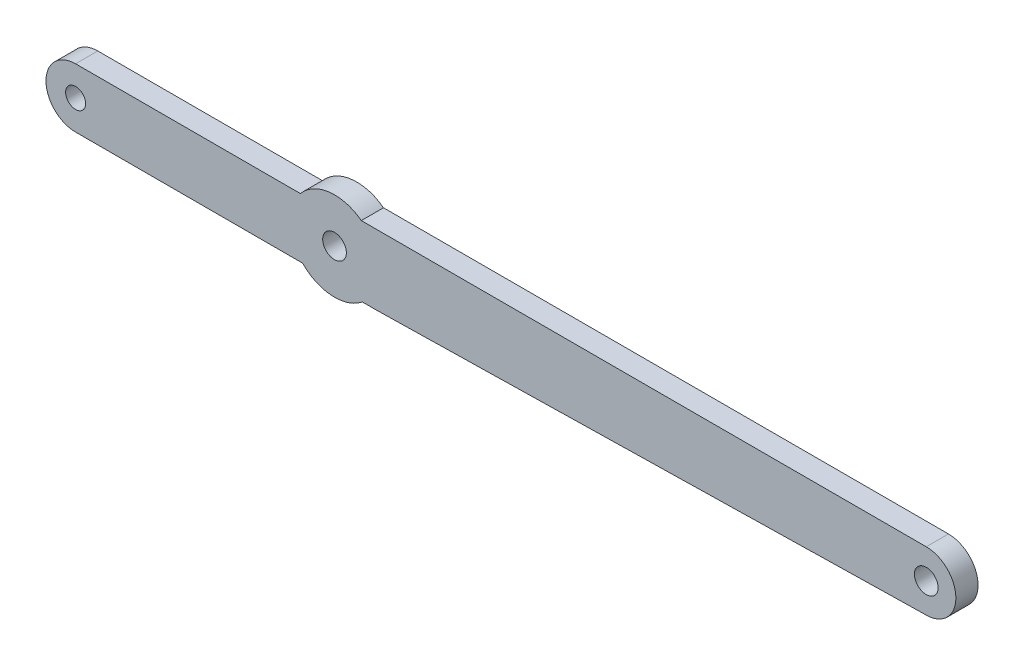
ISO-10303-21;
HEADER;
FILE_DESCRIPTION(('STEP AP214'),'2;1');
FILE_NAME('part.step','',(''),(''),'','','');
FILE_SCHEMA(('AUTOMOTIVE_DESIGN { 1 0 10303 214 1 1 1 1 }'));
ENDSEC;
DATA;
#1=APPLICATION_CONTEXT('core data for automotive mechanical design processes');
#2=APPLICATION_PROTOCOL_DEFINITION('international standard','automotive_design',2000,#1);
#3=PRODUCT_CONTEXT('',#1,'mechanical');
#4=PRODUCT('Part','Part','',(#3));
#5=PRODUCT_RELATED_PRODUCT_CATEGORY('part','',(#4));
#6=PRODUCT_DEFINITION_FORMATION('','',#4);
#7=PRODUCT_DEFINITION_CONTEXT('part definition',#1,'design');
#8=PRODUCT_DEFINITION('design','',#6,#7);
#9=PRODUCT_DEFINITION_SHAPE('','',#8);
#10=(LENGTH_UNIT() NAMED_UNIT(*) SI_UNIT(.MILLI.,.METRE.));
#11=(NAMED_UNIT(*) PLANE_ANGLE_UNIT() SI_UNIT($,.RADIAN.));
#12=(NAMED_UNIT(*) SI_UNIT($,.STERADIAN.) SOLID_ANGLE_UNIT());
#13=UNCERTAINTY_MEASURE_WITH_UNIT(LENGTH_MEASURE(1.E-05),#10,'distance_accuracy_value','');
#14=(GEOMETRIC_REPRESENTATION_CONTEXT(3) GLOBAL_UNCERTAINTY_ASSIGNED_CONTEXT((#13)) GLOBAL_UNIT_ASSIGNED_CONTEXT((#10,
#11,#12)) REPRESENTATION_CONTEXT('',''));
#15=CARTESIAN_POINT('',(0.,0.,0.));
#16=DIRECTION('',(0.,0.,1.));
#17=DIRECTION('',(1.,0.,0.));
#18=AXIS2_PLACEMENT_3D('',#15,#16,#17);
#19=CARTESIAN_POINT('',(-56.215610459493,3.68212259985008,-1.40729441988618E-11));
#20=DIRECTION('',(0.,0.,1.));
#21=DIRECTION('',(1.,0.,0.));
#22=AXIS2_PLACEMENT_3D('',#19,#20,#21);
#23=PLANE('',#22);
#24=CARTESIAN_POINT('',(-56.215610459493,3.68212259985008,0.));
#25=DIRECTION('',(0.,0.,-1.));
#26=DIRECTION('',(-1.,0.,0.));
#27=AXIS2_PLACEMENT_3D('',#24,#25,#26);
#28=CIRCLE('',#27,1.6);
#29=CARTESIAN_POINT('',(-57.815610459493,3.68212259985008,0.));
#30=VERTEX_POINT('',#29);
#31=EDGE_CURVE('E239',#30,#30,#28,.T.);
#32=ORIENTED_EDGE('',*,*,#31,.F.);
#33=EDGE_LOOP('',(#32));
#34=FACE_BOUND('',#33,.T.);
#35=CARTESIAN_POINT('',(-91.2186643045453,3.51409417940278,0.));
#36=DIRECTION('',(0.,0.,-1.));
#37=DIRECTION('',(-1.,0.,0.));
#38=AXIS2_PLACEMENT_3D('',#35,#36,#37);
#39=CIRCLE('',#38,1.35000000000001);
#40=CARTESIAN_POINT('',(-92.5686643045453,3.51409417940278,0.));
#41=VERTEX_POINT('',#40);
#42=EDGE_CURVE('E251',#41,#41,#39,.T.);
#43=ORIENTED_EDGE('',*,*,#42,.F.);
#44=EDGE_LOOP('',(#43));
#45=FACE_BOUND('',#44,.T.);
#46=CARTESIAN_POINT('',(-56.215610459493,3.68212259985008,-1.40729441988618E-11));
#47=DIRECTION('',(0.,0.,1.));
#48=DIRECTION('',(1.,0.,0.));
#49=AXIS2_PLACEMENT_3D('',#46,#47,#48);
#50=CIRCLE('',#49,6.);
#51=CARTESIAN_POINT('',(-52.5963583188452,8.46762298564217,-1.40729441988618E-11));
#52=VERTEX_POINT('',#51);
#53=CARTESIAN_POINT('',(-60.8325351733583,7.51409417940278,-1.40729441988618E-11));
#54=VERTEX_POINT('',#53);
#55=EDGE_CURVE('E179',#52,#54,#50,.T.);
#56=ORIENTED_EDGE('',*,*,#55,.F.);
#57=DIRECTION('',(-1.,0.,0.));
#58=VECTOR('',#57,1.);
#59=CARTESIAN_POINT('',(23.778016459137,8.46762298564218,-1.40729441988618E-11));
#60=LINE('',#59,#58);
#61=CARTESIAN_POINT('',(23.778016459137,8.46762298564218,-1.40729441988618E-11));
#62=VERTEX_POINT('',#61);
#63=EDGE_CURVE('E139',#62,#52,#60,.T.);
#64=ORIENTED_EDGE('',*,*,#63,.F.);
#65=CARTESIAN_POINT('',(23.7780164591309,4.46772306187524,-1.40729441988618E-11));
#66=DIRECTION('',(0.,0.,1.));
#67=DIRECTION('',(1.,0.,0.));
#68=AXIS2_PLACEMENT_3D('',#65,#66,#67);
#69=CIRCLE('',#68,3.99989992376694);
#70=CARTESIAN_POINT('',(23.8565679815805,0.468594524497169,-1.40729441988618E-11));
#71=VERTEX_POINT('',#70);
#72=EDGE_CURVE('E129',#71,#62,#69,.T.);
#73=ORIENTED_EDGE('',*,*,#72,.F.);
#74=DIRECTION('',(0.99980714857782,0.0196383719459742,0.));
#75=VECTOR('',#74,1.);
#76=CARTESIAN_POINT('',(-50.4209825448811,-0.990377004711705,-1.40729441988618E-11));
#77=LINE('',#76,#75);
#78=CARTESIAN_POINT('',(-50.4209825448811,-0.990377004711705,-1.40729441988618E-11));
#79=VERTEX_POINT('',#78);
#80=EDGE_CURVE('E118',#79,#71,#77,.T.);
#81=ORIENTED_EDGE('',*,*,#80,.F.);
#82=DIRECTION('',(1.,0.,0.));
#83=VECTOR('',#82,1.);
#84=CARTESIAN_POINT('',(-52.4516036256297,-0.990377004711713,-1.40729441988618E-11));
#85=LINE('',#84,#83);
#86=CARTESIAN_POINT('',(-52.4516036256297,-0.990377004711713,-1.40729441988618E-11));
#87=VERTEX_POINT('',#86);
#88=EDGE_CURVE('E130',#87,#79,#85,.T.);
#89=ORIENTED_EDGE('',*,*,#88,.F.);
#90=CARTESIAN_POINT('',(-56.215610459493,3.68212259985008,-1.40729441988618E-11));
#91=DIRECTION('',(0.,0.,1.));
#92=DIRECTION('',(1.,0.,0.));
#93=AXIS2_PLACEMENT_3D('',#90,#91,#92);
#94=CIRCLE('',#93,6.);
#95=CARTESIAN_POINT('',(-60.5315737455212,-0.485905820597219,-1.40729441988618E-11));
#96=VERTEX_POINT('',#95);
#97=EDGE_CURVE('E272',#96,#87,#94,.T.);
#98=ORIENTED_EDGE('',*,*,#97,.F.);
#99=DIRECTION('',(1.,0.,0.));
#100=VECTOR('',#99,1.);
#101=CARTESIAN_POINT('',(-91.2186643045453,-0.485905820597216,-1.40729441988618E-11));
#102=LINE('',#101,#100);
#103=CARTESIAN_POINT('',(-91.2186643045453,-0.485905820597216,-1.40729441988618E-11));
#104=VERTEX_POINT('',#103);
#105=EDGE_CURVE('E268',#104,#96,#102,.T.);
#106=ORIENTED_EDGE('',*,*,#105,.F.);
#107=CARTESIAN_POINT('',(-91.2186643045453,3.51409417940278,-1.40729441988618E-11));
#108=DIRECTION('',(0.,0.,1.));
#109=DIRECTION('',(1.,0.,0.));
#110=AXIS2_PLACEMENT_3D('',#107,#108,#109);
#111=CIRCLE('',#110,4.);
#112=CARTESIAN_POINT('',(-91.2186643045453,7.51409417940278,-1.40729441988618E-11));
#113=VERTEX_POINT('',#112);
#114=EDGE_CURVE('E264',#113,#104,#111,.T.);
#115=ORIENTED_EDGE('',*,*,#114,.F.);
#116=DIRECTION('',(-1.,0.,0.));
#117=VECTOR('',#116,1.);
#118=CARTESIAN_POINT('',(-60.8325351733583,7.51409417940278,-1.40729441988618E-11));
#119=LINE('',#118,#117);
#120=EDGE_CURVE('E261',#54,#113,#119,.T.);
#121=ORIENTED_EDGE('',*,*,#120,.F.);
#122=EDGE_LOOP('',(#56,#64,#73,#81,#89,#98,#106,#115,#121));
#123=FACE_BOUND('',#122,.T.);
#124=CARTESIAN_POINT('',(23.7780174551179,4.4678231769752,0.));
#125=DIRECTION('',(0.,0.,1.));
#126=DIRECTION('',(1.,0.,0.));
#127=AXIS2_PLACEMENT_3D('',#124,#125,#126);
#128=CIRCLE('',#127,1.6);
#129=CARTESIAN_POINT('',(25.3780174551179,4.4678231769752,0.));
#130=VERTEX_POINT('',#129);
#131=EDGE_CURVE('E237',#130,#130,#128,.T.);
#132=ORIENTED_EDGE('',*,*,#131,.T.);
#133=EDGE_LOOP('',(#132));
#134=FACE_BOUND('',#133,.T.);
#135=ADVANCED_FACE('F39',(#34,#45,#123,#134),#23,.F.);
#136=CARTESIAN_POINT('',(-56.215610459493,3.68212259985008,3.));
#137=DIRECTION('',(0.,0.,1.));
#138=DIRECTION('',(1.,0.,0.));
#139=AXIS2_PLACEMENT_3D('',#136,#137,#138);
#140=PLANE('',#139);
#141=CARTESIAN_POINT('',(-56.215610459493,3.68212259985008,3.));
#142=DIRECTION('',(0.,0.,1.));
#143=DIRECTION('',(1.,0.,0.));
#144=AXIS2_PLACEMENT_3D('',#141,#142,#143);
#145=CIRCLE('',#144,6.);
#146=CARTESIAN_POINT('',(-52.5963583188452,8.46762298564217,3.));
#147=VERTEX_POINT('',#146);
#148=CARTESIAN_POINT('',(-60.8325351733583,7.51409417940278,3.));
#149=VERTEX_POINT('',#148);
#150=EDGE_CURVE('E146',#147,#149,#145,.T.);
#151=ORIENTED_EDGE('',*,*,#150,.T.);
#152=DIRECTION('',(-1.,0.,0.));
#153=VECTOR('',#152,1.);
#154=CARTESIAN_POINT('',(-60.8325351733583,7.51409417940278,3.));
#155=LINE('',#154,#153);
#156=CARTESIAN_POINT('',(-91.2186643045453,7.51409417940278,3.));
#157=VERTEX_POINT('',#156);
#158=EDGE_CURVE('E150',#149,#157,#155,.T.);
#159=ORIENTED_EDGE('',*,*,#158,.T.);
#160=CARTESIAN_POINT('',(-91.2186643045453,3.51409417940278,3.));
#161=DIRECTION('',(0.,0.,1.));
#162=DIRECTION('',(1.,0.,0.));
#163=AXIS2_PLACEMENT_3D('',#160,#161,#162);
#164=CIRCLE('',#163,4.);
#165=CARTESIAN_POINT('',(-91.2186643045453,-0.485905820597216,3.));
#166=VERTEX_POINT('',#165);
#167=EDGE_CURVE('E155',#157,#166,#164,.T.);
#168=ORIENTED_EDGE('',*,*,#167,.T.);
#169=DIRECTION('',(1.,0.,0.));
#170=VECTOR('',#169,1.);
#171=CARTESIAN_POINT('',(-91.2186643045453,-0.485905820597216,3.));
#172=LINE('',#171,#170);
#173=CARTESIAN_POINT('',(-60.5315737455212,-0.485905820597219,3.));
#174=VERTEX_POINT('',#173);
#175=EDGE_CURVE('E159',#166,#174,#172,.T.);
#176=ORIENTED_EDGE('',*,*,#175,.T.);
#177=CARTESIAN_POINT('',(-56.215610459493,3.68212259985008,3.));
#178=DIRECTION('',(0.,0.,1.));
#179=DIRECTION('',(1.,0.,0.));
#180=AXIS2_PLACEMENT_3D('',#177,#178,#179);
#181=CIRCLE('',#180,6.);
#182=CARTESIAN_POINT('',(-52.4516036256297,-0.990377004711713,3.));
#183=VERTEX_POINT('',#182);
#184=EDGE_CURVE('E163',#174,#183,#181,.T.);
#185=ORIENTED_EDGE('',*,*,#184,.T.);
#186=DIRECTION('',(1.,0.,0.));
#187=VECTOR('',#186,1.);
#188=CARTESIAN_POINT('',(-52.4516036256297,-0.990377004711713,3.));
#189=LINE('',#188,#187);
#190=CARTESIAN_POINT('',(-50.4209825448811,-0.990377004711705,3.));
#191=VERTEX_POINT('',#190);
#192=EDGE_CURVE('E167',#183,#191,#189,.T.);
#193=ORIENTED_EDGE('',*,*,#192,.T.);
#194=DIRECTION('',(0.999807148577821,0.0196383719459381,0.));
#195=VECTOR('',#194,1.);
#196=CARTESIAN_POINT('',(23.8165609183604,0.467808699361691,3.));
#197=LINE('',#196,#195);
#198=CARTESIAN_POINT('',(23.8565679815805,0.468594524497169,3.));
#199=VERTEX_POINT('',#198);
#200=EDGE_CURVE('E171',#191,#199,#197,.T.);
#201=ORIENTED_EDGE('',*,*,#200,.T.);
#202=CARTESIAN_POINT('',(23.7780164591309,4.46772306187524,3.));
#203=DIRECTION('',(0.,0.,1.));
#204=DIRECTION('',(1.,0.,0.));
#205=AXIS2_PLACEMENT_3D('',#202,#203,#204);
#206=CIRCLE('',#205,3.99989992376694);
#207=CARTESIAN_POINT('',(23.778016459137,8.46762298564218,3.));
#208=VERTEX_POINT('',#207);
#209=EDGE_CURVE('E134',#199,#208,#206,.T.);
#210=ORIENTED_EDGE('',*,*,#209,.T.);
#211=DIRECTION('',(-1.,0.,0.));
#212=VECTOR('',#211,1.);
#213=CARTESIAN_POINT('',(23.778016459137,8.46762298564218,3.));
#214=LINE('',#213,#212);
#215=EDGE_CURVE('E176',#208,#147,#214,.T.);
#216=ORIENTED_EDGE('',*,*,#215,.T.);
#217=EDGE_LOOP('',(#151,#159,#168,#176,#185,#193,#201,#210,#216));
#218=FACE_BOUND('',#217,.T.);
#219=CARTESIAN_POINT('',(-91.2186643045453,3.51409417940278,3.));
#220=DIRECTION('',(0.,0.,-1.));
#221=DIRECTION('',(-1.,0.,0.));
#222=AXIS2_PLACEMENT_3D('',#219,#220,#221);
#223=CIRCLE('',#222,1.35000000000001);
#224=CARTESIAN_POINT('',(-92.5686643045453,3.51409417940278,3.));
#225=VERTEX_POINT('',#224);
#226=EDGE_CURVE('E255',#225,#225,#223,.T.);
#227=ORIENTED_EDGE('',*,*,#226,.T.);
#228=EDGE_LOOP('',(#227));
#229=FACE_BOUND('',#228,.T.);
#230=CARTESIAN_POINT('',(-56.215610459493,3.68212259985008,3.));
#231=DIRECTION('',(0.,0.,-1.));
#232=DIRECTION('',(-1.,0.,0.));
#233=AXIS2_PLACEMENT_3D('',#230,#231,#232);
#234=CIRCLE('',#233,1.6);
#235=CARTESIAN_POINT('',(-57.815610459493,3.68212259985008,3.));
#236=VERTEX_POINT('',#235);
#237=EDGE_CURVE('E245',#236,#236,#234,.T.);
#238=ORIENTED_EDGE('',*,*,#237,.T.);
#239=EDGE_LOOP('',(#238));
#240=FACE_BOUND('',#239,.T.);
#241=CARTESIAN_POINT('',(23.7780174551179,4.4678231769752,3.));
#242=DIRECTION('',(0.,0.,1.));
#243=DIRECTION('',(1.,0.,0.));
#244=AXIS2_PLACEMENT_3D('',#241,#242,#243);
#245=CIRCLE('',#244,1.6);
#246=CARTESIAN_POINT('',(25.3780174551179,4.4678231769752,3.));
#247=VERTEX_POINT('',#246);
#248=EDGE_CURVE('E151',#247,#247,#245,.T.);
#249=ORIENTED_EDGE('',*,*,#248,.F.);
#250=EDGE_LOOP('',(#249));
#251=FACE_BOUND('',#250,.T.);
#252=ADVANCED_FACE('F199',(#218,#229,#240,#251),#140,.T.);
#253=CARTESIAN_POINT('',(-56.215610459493,3.68212259985008,-1.40729441988618E-11));
#254=DIRECTION('',(0.,0.,1.));
#255=DIRECTION('',(1.,0.,0.));
#256=AXIS2_PLACEMENT_3D('',#253,#254,#255);
#257=CYLINDRICAL_SURFACE('',#256,6.);
#258=ORIENTED_EDGE('',*,*,#150,.F.);
#259=DIRECTION('',(0.,0.,1.));
#260=VECTOR('',#259,1.);
#261=CARTESIAN_POINT('',(-52.5963583188452,8.46762298564217,-1.40729441988618E-11));
#262=LINE('',#261,#260);
#263=EDGE_CURVE('E11',#52,#147,#262,.T.);
#264=ORIENTED_EDGE('',*,*,#263,.F.);
#265=ORIENTED_EDGE('',*,*,#55,.T.);
#266=DIRECTION('',(0.,0.,1.));
#267=VECTOR('',#266,1.);
#268=CARTESIAN_POINT('',(-60.8325351733583,7.51409417940278,-1.40729441988618E-11));
#269=LINE('',#268,#267);
#270=EDGE_CURVE('E43',#54,#149,#269,.T.);
#271=ORIENTED_EDGE('',*,*,#270,.T.);
#272=EDGE_LOOP('',(#258,#264,#265,#271));
#273=FACE_BOUND('',#272,.T.);
#274=ADVANCED_FACE('F41',(#273),#257,.T.);
#275=CARTESIAN_POINT('',(23.778016459137,8.46762298564218,-1.40729441988618E-11));
#276=DIRECTION('',(0.,1.,0.));
#277=DIRECTION('',(-1.,0.,0.));
#278=AXIS2_PLACEMENT_3D('',#275,#276,#277);
#279=PLANE('',#278);
#280=ORIENTED_EDGE('',*,*,#215,.F.);
#281=DIRECTION('',(0.,0.,1.));
#282=VECTOR('',#281,1.);
#283=CARTESIAN_POINT('',(23.778016459137,8.46762298564218,-1.40729441988618E-11));
#284=LINE('',#283,#282);
#285=EDGE_CURVE('E50',#62,#208,#284,.T.);
#286=ORIENTED_EDGE('',*,*,#285,.F.);
#287=ORIENTED_EDGE('',*,*,#63,.T.);
#288=ORIENTED_EDGE('',*,*,#263,.T.);
#289=EDGE_LOOP('',(#280,#286,#287,#288));
#290=FACE_BOUND('',#289,.T.);
#291=ADVANCED_FACE('F201',(#290),#279,.T.);
#292=CARTESIAN_POINT('',(23.7780164591309,4.46772306187524,-1.40729441988618E-11));
#293=DIRECTION('',(0.,0.,1.));
#294=DIRECTION('',(1.,0.,0.));
#295=AXIS2_PLACEMENT_3D('',#292,#293,#294);
#296=CYLINDRICAL_SURFACE('',#295,3.99989992376694);
#297=ORIENTED_EDGE('',*,*,#209,.F.);
#298=DIRECTION('',(0.,0.,1.));
#299=VECTOR('',#298,1.);
#300=CARTESIAN_POINT('',(23.8565679815805,0.468594524497169,-1.40729441988618E-11));
#301=LINE('',#300,#299);
#302=EDGE_CURVE('E121',#71,#199,#301,.T.);
#303=ORIENTED_EDGE('',*,*,#302,.F.);
#304=ORIENTED_EDGE('',*,*,#72,.T.);
#305=ORIENTED_EDGE('',*,*,#285,.T.);
#306=EDGE_LOOP('',(#297,#303,#304,#305));
#307=FACE_BOUND('',#306,.T.);
#308=ADVANCED_FACE('F132',(#307),#296,.T.);
#309=CARTESIAN_POINT('',(23.8165609183604,0.467808699361691,-1.40729441988618E-11));
#310=DIRECTION('',(0.0196383719459381,-0.999807148577821,0.));
#311=DIRECTION('',(0.999807148577821,0.0196383719459381,0.));
#312=AXIS2_PLACEMENT_3D('',#309,#310,#311);
#313=PLANE('',#312);
#314=ORIENTED_EDGE('',*,*,#200,.F.);
#315=DIRECTION('',(0.,0.,1.));
#316=VECTOR('',#315,1.);
#317=CARTESIAN_POINT('',(-50.4209825448811,-0.990377004711705,-1.40729441988618E-11));
#318=LINE('',#317,#316);
#319=EDGE_CURVE('E123',#79,#191,#318,.T.);
#320=ORIENTED_EDGE('',*,*,#319,.F.);
#321=ORIENTED_EDGE('',*,*,#80,.T.);
#322=ORIENTED_EDGE('',*,*,#302,.T.);
#323=EDGE_LOOP('',(#314,#320,#321,#322));
#324=FACE_BOUND('',#323,.T.);
#325=ADVANCED_FACE('F120',(#324),#313,.T.);
#326=CARTESIAN_POINT('',(-52.4516036256297,-0.990377004711713,-1.40729441988618E-11));
#327=DIRECTION('',(0.,-1.,0.));
#328=DIRECTION('',(1.,0.,0.));
#329=AXIS2_PLACEMENT_3D('',#326,#327,#328);
#330=PLANE('',#329);
#331=ORIENTED_EDGE('',*,*,#192,.F.);
#332=DIRECTION('',(0.,0.,1.));
#333=VECTOR('',#332,1.);
#334=CARTESIAN_POINT('',(-52.4516036256297,-0.990377004711713,-1.40729441988618E-11));
#335=LINE('',#334,#333);
#336=EDGE_CURVE('E185',#87,#183,#335,.T.);
#337=ORIENTED_EDGE('',*,*,#336,.F.);
#338=ORIENTED_EDGE('',*,*,#88,.T.);
#339=ORIENTED_EDGE('',*,*,#319,.T.);
#340=EDGE_LOOP('',(#331,#337,#338,#339));
#341=FACE_BOUND('',#340,.T.);
#342=ADVANCED_FACE('F278',(#341),#330,.T.);
#343=CARTESIAN_POINT('',(-56.215610459493,3.68212259985008,-1.40729441988618E-11));
#344=DIRECTION('',(0.,0.,1.));
#345=DIRECTION('',(1.,0.,0.));
#346=AXIS2_PLACEMENT_3D('',#343,#344,#345);
#347=CYLINDRICAL_SURFACE('',#346,6.);
#348=ORIENTED_EDGE('',*,*,#184,.F.);
#349=DIRECTION('',(0.,0.,1.));
#350=VECTOR('',#349,1.);
#351=CARTESIAN_POINT('',(-60.5315737455212,-0.485905820597219,-1.40729441988618E-11));
#352=LINE('',#351,#350);
#353=EDGE_CURVE('E188',#96,#174,#352,.T.);
#354=ORIENTED_EDGE('',*,*,#353,.F.);
#355=ORIENTED_EDGE('',*,*,#97,.T.);
#356=ORIENTED_EDGE('',*,*,#336,.T.);
#357=EDGE_LOOP('',(#348,#354,#355,#356));
#358=FACE_BOUND('',#357,.T.);
#359=ADVANCED_FACE('F283',(#358),#347,.T.);
#360=CARTESIAN_POINT('',(-91.2186643045453,-0.485905820597216,-1.40729441988618E-11));
#361=DIRECTION('',(0.,-1.,0.));
#362=DIRECTION('',(1.,0.,0.));
#363=AXIS2_PLACEMENT_3D('',#360,#361,#362);
#364=PLANE('',#363);
#365=ORIENTED_EDGE('',*,*,#175,.F.);
#366=DIRECTION('',(0.,0.,1.));
#367=VECTOR('',#366,1.);
#368=CARTESIAN_POINT('',(-91.2186643045453,-0.485905820597216,-1.40729441988618E-11));
#369=LINE('',#368,#367);
#370=EDGE_CURVE('E191',#104,#166,#369,.T.);
#371=ORIENTED_EDGE('',*,*,#370,.F.);
#372=ORIENTED_EDGE('',*,*,#105,.T.);
#373=ORIENTED_EDGE('',*,*,#353,.T.);
#374=EDGE_LOOP('',(#365,#371,#372,#373));
#375=FACE_BOUND('',#374,.T.);
#376=ADVANCED_FACE('F286',(#375),#364,.T.);
#377=CARTESIAN_POINT('',(-91.2186643045453,3.51409417940278,-1.40729441988618E-11));
#378=DIRECTION('',(0.,0.,1.));
#379=DIRECTION('',(1.,0.,0.));
#380=AXIS2_PLACEMENT_3D('',#377,#378,#379);
#381=CYLINDRICAL_SURFACE('',#380,4.);
#382=ORIENTED_EDGE('',*,*,#167,.F.);
#383=DIRECTION('',(0.,0.,1.));
#384=VECTOR('',#383,1.);
#385=CARTESIAN_POINT('',(-91.2186643045453,7.51409417940278,-1.40729441988618E-11));
#386=LINE('',#385,#384);
#387=EDGE_CURVE('E193',#113,#157,#386,.T.);
#388=ORIENTED_EDGE('',*,*,#387,.F.);
#389=ORIENTED_EDGE('',*,*,#114,.T.);
#390=ORIENTED_EDGE('',*,*,#370,.T.);
#391=EDGE_LOOP('',(#382,#388,#389,#390));
#392=FACE_BOUND('',#391,.T.);
#393=ADVANCED_FACE('F289',(#392),#381,.T.);
#394=CARTESIAN_POINT('',(-60.8325351733583,7.51409417940278,-1.40729441988618E-11));
#395=DIRECTION('',(0.,1.,0.));
#396=DIRECTION('',(-1.,0.,0.));
#397=AXIS2_PLACEMENT_3D('',#394,#395,#396);
#398=PLANE('',#397);
#399=ORIENTED_EDGE('',*,*,#158,.F.);
#400=ORIENTED_EDGE('',*,*,#270,.F.);
#401=ORIENTED_EDGE('',*,*,#120,.T.);
#402=ORIENTED_EDGE('',*,*,#387,.T.);
#403=EDGE_LOOP('',(#399,#400,#401,#402));
#404=FACE_BOUND('',#403,.T.);
#405=ADVANCED_FACE('F197',(#404),#398,.T.);
#406=CARTESIAN_POINT('',(-91.2186643045453,3.51409417940278,3.));
#407=DIRECTION('',(0.,0.,-1.));
#408=DIRECTION('',(-1.,0.,0.));
#409=AXIS2_PLACEMENT_3D('',#406,#407,#408);
#410=CYLINDRICAL_SURFACE('',#409,1.35000000000001);
#411=ORIENTED_EDGE('',*,*,#226,.F.);
#412=EDGE_LOOP('',(#411));
#413=FACE_BOUND('',#412,.T.);
#414=ORIENTED_EDGE('',*,*,#42,.T.);
#415=EDGE_LOOP('',(#414));
#416=FACE_BOUND('',#415,.T.);
#417=ADVANCED_FACE('F219',(#413,#416),#410,.F.);
#418=CARTESIAN_POINT('',(-56.215610459493,3.68212259985008,3.));
#419=DIRECTION('',(0.,0.,-1.));
#420=DIRECTION('',(-1.,0.,0.));
#421=AXIS2_PLACEMENT_3D('',#418,#419,#420);
#422=CYLINDRICAL_SURFACE('',#421,1.6);
#423=ORIENTED_EDGE('',*,*,#237,.F.);
#424=EDGE_LOOP('',(#423));
#425=FACE_BOUND('',#424,.T.);
#426=ORIENTED_EDGE('',*,*,#31,.T.);
#427=EDGE_LOOP('',(#426));
#428=FACE_BOUND('',#427,.T.);
#429=ADVANCED_FACE('F222',(#425,#428),#422,.F.);
#430=CARTESIAN_POINT('',(23.7780174551179,4.4678231769752,3.));
#431=DIRECTION('',(0.,0.,-1.));
#432=DIRECTION('',(-1.,0.,0.));
#433=AXIS2_PLACEMENT_3D('',#430,#431,#432);
#434=CYLINDRICAL_SURFACE('',#433,1.6);
#435=ORIENTED_EDGE('',*,*,#248,.T.);
#436=EDGE_LOOP('',(#435));
#437=FACE_BOUND('',#436,.T.);
#438=ORIENTED_EDGE('',*,*,#131,.F.);
#439=EDGE_LOOP('',(#438));
#440=FACE_BOUND('',#439,.T.);
#441=ADVANCED_FACE('F226',(#437,#440),#434,.F.);
#442=CLOSED_SHELL('',(#135,#252,#274,#291,#308,#325,#342,#359,#376,#393,#405,#417,#429,#441));
#443=MANIFOLD_SOLID_BREP('B2',#442);
#444=ADVANCED_BREP_SHAPE_REPRESENTATION('',(#18,#443),#14);
#445=SHAPE_DEFINITION_REPRESENTATION(#9,#444);
ENDSEC;
END-ISO-10303-21;
